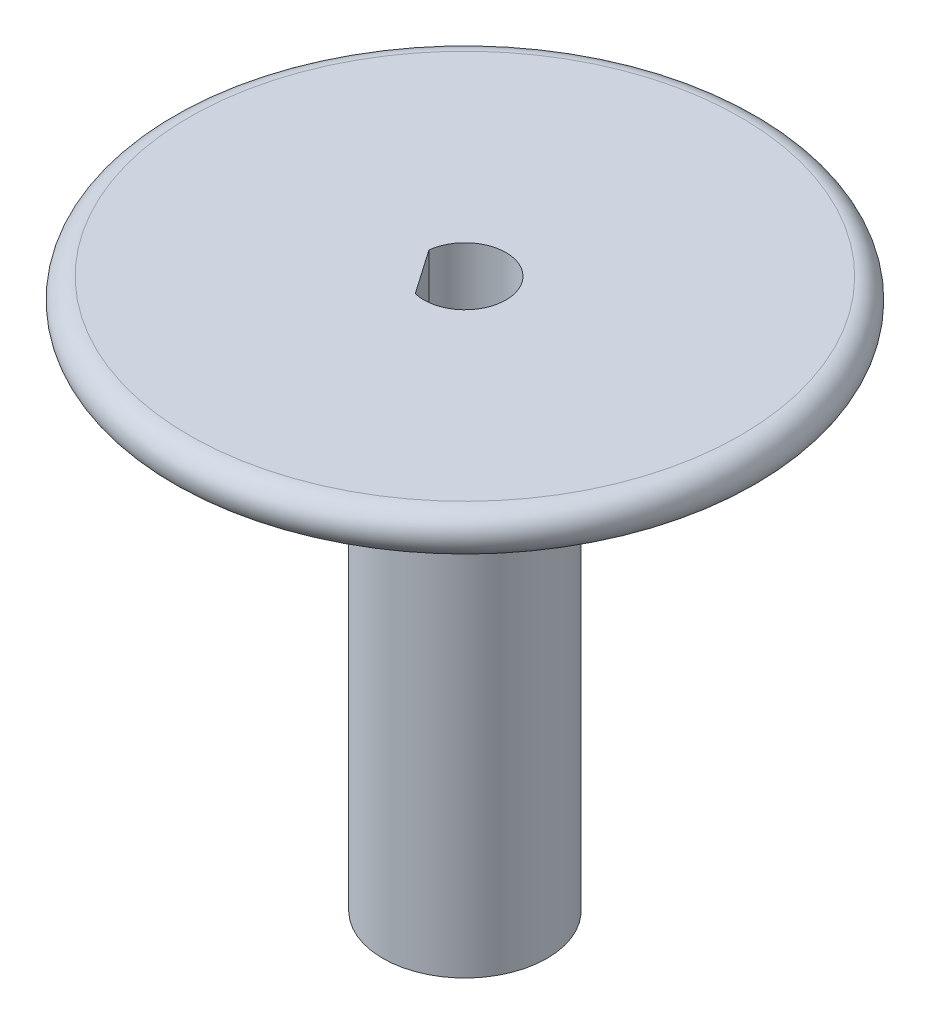
ISO-10303-21;
HEADER;
FILE_DESCRIPTION(('STEP AP214'),'2;1');
FILE_NAME('part.step','',(''),(''),'','','');
FILE_SCHEMA(('AUTOMOTIVE_DESIGN { 1 0 10303 214 1 1 1 1 }'));
ENDSEC;
DATA;
#1=APPLICATION_CONTEXT('core data for automotive mechanical design processes');
#2=APPLICATION_PROTOCOL_DEFINITION('international standard','automotive_design',2000,#1);
#3=PRODUCT_CONTEXT('',#1,'mechanical');
#4=PRODUCT('Part','Part','',(#3));
#5=PRODUCT_RELATED_PRODUCT_CATEGORY('part','',(#4));
#6=PRODUCT_DEFINITION_FORMATION('','',#4);
#7=PRODUCT_DEFINITION_CONTEXT('part definition',#1,'design');
#8=PRODUCT_DEFINITION('design','',#6,#7);
#9=PRODUCT_DEFINITION_SHAPE('','',#8);
#10=(LENGTH_UNIT() NAMED_UNIT(*) SI_UNIT(.MILLI.,.METRE.));
#11=(NAMED_UNIT(*) PLANE_ANGLE_UNIT() SI_UNIT($,.RADIAN.));
#12=(NAMED_UNIT(*) SI_UNIT($,.STERADIAN.) SOLID_ANGLE_UNIT());
#13=UNCERTAINTY_MEASURE_WITH_UNIT(LENGTH_MEASURE(1.E-05),#10,'distance_accuracy_value','');
#14=(GEOMETRIC_REPRESENTATION_CONTEXT(3) GLOBAL_UNCERTAINTY_ASSIGNED_CONTEXT((#13)) GLOBAL_UNIT_ASSIGNED_CONTEXT((#10,
#11,#12)) REPRESENTATION_CONTEXT('',''));
#15=CARTESIAN_POINT('',(0.,0.,0.));
#16=DIRECTION('',(0.,0.,1.));
#17=DIRECTION('',(1.,0.,0.));
#18=AXIS2_PLACEMENT_3D('',#15,#16,#17);
#19=CARTESIAN_POINT('',(0.,18.26337642131,0.));
#20=DIRECTION('',(0.,1.,0.));
#21=DIRECTION('',(-1.,0.,0.));
#22=AXIS2_PLACEMENT_3D('',#19,#20,#21);
#23=PLANE('',#22);
#24=CARTESIAN_POINT('',(0.,18.26337642131,0.));
#25=DIRECTION('',(0.,1.,0.));
#26=DIRECTION('',(-1.,0.,0.));
#27=AXIS2_PLACEMENT_3D('',#24,#25,#26);
#28=CIRCLE('',#27,2.54);
#29=CARTESIAN_POINT('',(-0.604738857402134,18.26337642131,2.46695985260157));
#30=VERTEX_POINT('',#29);
#31=CARTESIAN_POINT('',(-2.52236653830522,18.26337642131,-0.298775913416984));
#32=VERTEX_POINT('',#31);
#33=EDGE_CURVE('E49',#30,#32,#28,.T.);
#34=ORIENTED_EDGE('',*,*,#33,.F.);
#35=DIRECTION('',(0.569789832388378,0.,0.821790451944304));
#36=VECTOR('',#35,1.);
#37=CARTESIAN_POINT('',(-0.604738857402134,18.26337642131,2.46695985260157));
#38=LINE('',#37,#36);
#39=EDGE_CURVE('E69',#32,#30,#38,.T.);
#40=ORIENTED_EDGE('',*,*,#39,.F.);
#41=EDGE_LOOP('',(#34,#40));
#42=FACE_BOUND('',#41,.T.);
#43=CARTESIAN_POINT('',(0.,18.26337642131,0.));
#44=DIRECTION('',(0.,-1.,0.));
#45=DIRECTION('',(1.,0.,0.));
#46=AXIS2_PLACEMENT_3D('',#43,#44,#45);
#47=CIRCLE('',#46,17.0415037859707);
#48=CARTESIAN_POINT('',(17.0415037859707,18.26337642131,0.));
#49=VERTEX_POINT('',#48);
#50=EDGE_CURVE('E11',#49,#49,#47,.T.);
#51=ORIENTED_EDGE('',*,*,#50,.F.);
#52=EDGE_LOOP('',(#51));
#53=FACE_BOUND('',#52,.T.);
#54=ADVANCED_FACE('F35',(#42,#53),#23,.T.);
#55=CARTESIAN_POINT('',(0.,16.99337642131,0.));
#56=DIRECTION('',(0.,-1.,0.));
#57=DIRECTION('',(1.,0.,0.));
#58=AXIS2_PLACEMENT_3D('',#55,#56,#57);
#59=TOROIDAL_SURFACE('',#58,17.0415037859707,1.27);
#60=ORIENTED_EDGE('',*,*,#50,.T.);
#61=EDGE_LOOP('',(#60));
#62=FACE_BOUND('',#61,.T.);
#63=CARTESIAN_POINT('',(0.,15.72337642131,0.));
#64=DIRECTION('',(0.,-1.,0.));
#65=DIRECTION('',(1.,0.,0.));
#66=AXIS2_PLACEMENT_3D('',#63,#64,#65);
#67=CIRCLE('',#66,17.0415037859707);
#68=CARTESIAN_POINT('',(17.0415037859707,15.72337642131,0.));
#69=VERTEX_POINT('',#68);
#70=EDGE_CURVE('E42',#69,#69,#67,.T.);
#71=ORIENTED_EDGE('',*,*,#70,.F.);
#72=EDGE_LOOP('',(#71));
#73=FACE_BOUND('',#72,.T.);
#74=ADVANCED_FACE('F90',(#62,#73),#59,.T.);
#75=CARTESIAN_POINT('',(5.08,15.72337642131,0.));
#76=DIRECTION('',(0.,-1.,0.));
#77=DIRECTION('',(1.,0.,0.));
#78=AXIS2_PLACEMENT_3D('',#75,#76,#77);
#79=PLANE('',#78);
#80=ORIENTED_EDGE('',*,*,#70,.T.);
#81=EDGE_LOOP('',(#80));
#82=FACE_BOUND('',#81,.T.);
#83=CARTESIAN_POINT('',(0.,15.72337642131,0.));
#84=DIRECTION('',(0.,-1.,0.));
#85=DIRECTION('',(1.,0.,0.));
#86=AXIS2_PLACEMENT_3D('',#83,#84,#85);
#87=CIRCLE('',#86,5.08000000000001);
#88=CARTESIAN_POINT('',(5.08,15.72337642131,0.));
#89=VERTEX_POINT('',#88);
#90=EDGE_CURVE('E82',#89,#89,#87,.T.);
#91=ORIENTED_EDGE('',*,*,#90,.F.);
#92=EDGE_LOOP('',(#91));
#93=FACE_BOUND('',#92,.T.);
#94=ADVANCED_FACE('F87',(#82,#93),#79,.T.);
#95=CARTESIAN_POINT('',(0.,-15.72337642131,0.));
#96=DIRECTION('',(0.,-1.,0.));
#97=DIRECTION('',(1.,0.,0.));
#98=AXIS2_PLACEMENT_3D('',#95,#96,#97);
#99=CYLINDRICAL_SURFACE('',#98,5.08000000000001);
#100=ORIENTED_EDGE('',*,*,#90,.T.);
#101=EDGE_LOOP('',(#100));
#102=FACE_BOUND('',#101,.T.);
#103=CARTESIAN_POINT('',(0.,-15.72337642131,0.));
#104=DIRECTION('',(0.,-1.,0.));
#105=DIRECTION('',(1.,0.,0.));
#106=AXIS2_PLACEMENT_3D('',#103,#104,#105);
#107=CIRCLE('',#106,5.08);
#108=CARTESIAN_POINT('',(5.08,-15.72337642131,0.));
#109=VERTEX_POINT('',#108);
#110=EDGE_CURVE('E65',#109,#109,#107,.T.);
#111=ORIENTED_EDGE('',*,*,#110,.F.);
#112=EDGE_LOOP('',(#111));
#113=FACE_BOUND('',#112,.T.);
#114=ADVANCED_FACE('F97',(#102,#113),#99,.T.);
#115=CARTESIAN_POINT('',(5.08,-15.72337642131,0.));
#116=DIRECTION('',(0.,-1.,0.));
#117=DIRECTION('',(1.,0.,0.));
#118=AXIS2_PLACEMENT_3D('',#115,#116,#117);
#119=PLANE('',#118);
#120=CARTESIAN_POINT('',(0.,-15.72337642131,0.));
#121=DIRECTION('',(0.,1.,0.));
#122=DIRECTION('',(-1.,0.,0.));
#123=AXIS2_PLACEMENT_3D('',#120,#121,#122);
#124=CIRCLE('',#123,2.54);
#125=CARTESIAN_POINT('',(-0.604738857402129,-15.72337642131,2.46695985260157));
#126=VERTEX_POINT('',#125);
#127=CARTESIAN_POINT('',(-2.52236653830521,-15.72337642131,-0.298775913416985));
#128=VERTEX_POINT('',#127);
#129=EDGE_CURVE('E54',#126,#128,#124,.T.);
#130=ORIENTED_EDGE('',*,*,#129,.T.);
#131=DIRECTION('',(0.569789832388378,0.,0.821790451944304));
#132=VECTOR('',#131,1.);
#133=CARTESIAN_POINT('',(-0.604738857402128,-15.72337642131,2.46695985260157));
#134=LINE('',#133,#132);
#135=EDGE_CURVE('E76',#128,#126,#134,.T.);
#136=ORIENTED_EDGE('',*,*,#135,.T.);
#137=EDGE_LOOP('',(#130,#136));
#138=FACE_BOUND('',#137,.T.);
#139=ORIENTED_EDGE('',*,*,#110,.T.);
#140=EDGE_LOOP('',(#139));
#141=FACE_BOUND('',#140,.T.);
#142=ADVANCED_FACE('F102',(#138,#141),#119,.T.);
#143=CARTESIAN_POINT('',(0.,-15.72337642131,0.));
#144=DIRECTION('',(0.,1.,0.));
#145=DIRECTION('',(-1.,0.,0.));
#146=AXIS2_PLACEMENT_3D('',#143,#144,#145);
#147=CYLINDRICAL_SURFACE('',#146,2.54);
#148=ORIENTED_EDGE('',*,*,#33,.T.);
#149=DIRECTION('',(0.,1.,0.));
#150=VECTOR('',#149,1.);
#151=CARTESIAN_POINT('',(-2.52236653830521,-15.72337642131,-0.298775913416985));
#152=LINE('',#151,#150);
#153=EDGE_CURVE('E66',#128,#32,#152,.T.);
#154=ORIENTED_EDGE('',*,*,#153,.F.);
#155=ORIENTED_EDGE('',*,*,#129,.F.);
#156=DIRECTION('',(0.,1.,0.));
#157=VECTOR('',#156,1.);
#158=CARTESIAN_POINT('',(-0.604738857402128,-15.72337642131,2.46695985260157));
#159=LINE('',#158,#157);
#160=EDGE_CURVE('E59',#126,#30,#159,.T.);
#161=ORIENTED_EDGE('',*,*,#160,.T.);
#162=EDGE_LOOP('',(#148,#154,#155,#161));
#163=FACE_BOUND('',#162,.T.);
#164=ADVANCED_FACE('F61',(#163),#147,.F.);
#165=CARTESIAN_POINT('',(-0.604738857402128,-15.72337642131,2.46695985260157));
#166=DIRECTION('',(-0.821790451944304,0.,0.569789832388378));
#167=DIRECTION('',(0.569789832388378,0.,0.821790451944305));
#168=AXIS2_PLACEMENT_3D('',#165,#166,#167);
#169=PLANE('',#168);
#170=ORIENTED_EDGE('',*,*,#39,.T.);
#171=ORIENTED_EDGE('',*,*,#160,.F.);
#172=ORIENTED_EDGE('',*,*,#135,.F.);
#173=ORIENTED_EDGE('',*,*,#153,.T.);
#174=EDGE_LOOP('',(#170,#171,#172,#173));
#175=FACE_BOUND('',#174,.T.);
#176=ADVANCED_FACE('F70',(#175),#169,.F.);
#177=CLOSED_SHELL('',(#54,#74,#94,#114,#142,#164,#176));
#178=MANIFOLD_SOLID_BREP('B2',#177);
#179=ADVANCED_BREP_SHAPE_REPRESENTATION('',(#18,#178),#14);
#180=SHAPE_DEFINITION_REPRESENTATION(#9,#179);
ENDSEC;
END-ISO-10303-21;
